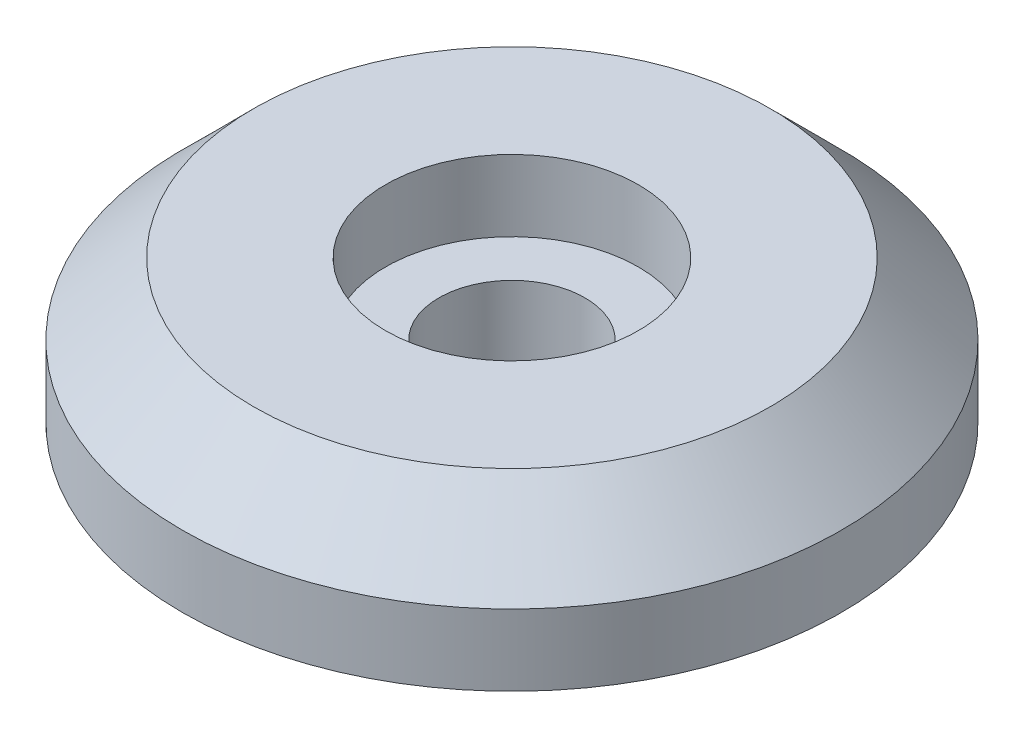
ISO-10303-21;
HEADER;
FILE_DESCRIPTION(('STEP AP214'),'2;1');
FILE_NAME('part.step','',(''),(''),'','','');
FILE_SCHEMA(('AUTOMOTIVE_DESIGN { 1 0 10303 214 1 1 1 1 }'));
ENDSEC;
DATA;
#1=APPLICATION_CONTEXT('core data for automotive mechanical design processes');
#2=APPLICATION_PROTOCOL_DEFINITION('international standard','automotive_design',2000,#1);
#3=PRODUCT_CONTEXT('',#1,'mechanical');
#4=PRODUCT('Part','Part','',(#3));
#5=PRODUCT_RELATED_PRODUCT_CATEGORY('part','',(#4));
#6=PRODUCT_DEFINITION_FORMATION('','',#4);
#7=PRODUCT_DEFINITION_CONTEXT('part definition',#1,'design');
#8=PRODUCT_DEFINITION('design','',#6,#7);
#9=PRODUCT_DEFINITION_SHAPE('','',#8);
#10=(LENGTH_UNIT() NAMED_UNIT(*) SI_UNIT(.MILLI.,.METRE.));
#11=(NAMED_UNIT(*) PLANE_ANGLE_UNIT() SI_UNIT($,.RADIAN.));
#12=(NAMED_UNIT(*) SI_UNIT($,.STERADIAN.) SOLID_ANGLE_UNIT());
#13=UNCERTAINTY_MEASURE_WITH_UNIT(LENGTH_MEASURE(1.E-05),#10,'distance_accuracy_value','');
#14=(GEOMETRIC_REPRESENTATION_CONTEXT(3) GLOBAL_UNCERTAINTY_ASSIGNED_CONTEXT((#13)) GLOBAL_UNIT_ASSIGNED_CONTEXT((#10,
#11,#12)) REPRESENTATION_CONTEXT('',''));
#15=CARTESIAN_POINT('',(0.,0.,0.));
#16=DIRECTION('',(0.,0.,1.));
#17=DIRECTION('',(1.,0.,0.));
#18=AXIS2_PLACEMENT_3D('',#15,#16,#17);
#19=CARTESIAN_POINT('',(0.,4.,0.));
#20=DIRECTION('',(0.,-1.,0.));
#21=DIRECTION('',(0.,0.,-1.));
#22=AXIS2_PLACEMENT_3D('',#19,#20,#21);
#23=CYLINDRICAL_SURFACE('',#22,2.05);
#24=CARTESIAN_POINT('',(0.,0.,0.));
#25=DIRECTION('',(0.,1.,0.));
#26=DIRECTION('',(0.,0.,1.));
#27=AXIS2_PLACEMENT_3D('',#24,#25,#26);
#28=CIRCLE('',#27,2.05);
#29=CARTESIAN_POINT('',(0.,0.,2.05));
#30=VERTEX_POINT('',#29);
#31=EDGE_CURVE('E63',#30,#30,#28,.T.);
#32=ORIENTED_EDGE('',*,*,#31,.F.);
#33=EDGE_LOOP('',(#32));
#34=FACE_BOUND('',#33,.T.);
#35=CARTESIAN_POINT('',(0.,2.,0.));
#36=DIRECTION('',(0.,1.,0.));
#37=DIRECTION('',(0.,0.,1.));
#38=AXIS2_PLACEMENT_3D('',#35,#36,#37);
#39=CIRCLE('',#38,2.05);
#40=CARTESIAN_POINT('',(0.,2.,2.05));
#41=VERTEX_POINT('',#40);
#42=EDGE_CURVE('E70',#41,#41,#39,.T.);
#43=ORIENTED_EDGE('',*,*,#42,.T.);
#44=EDGE_LOOP('',(#43));
#45=FACE_BOUND('',#44,.T.);
#46=ADVANCED_FACE('F44',(#34,#45),#23,.F.);
#47=CARTESIAN_POINT('',(0.,4.,0.));
#48=DIRECTION('',(0.,1.,0.));
#49=DIRECTION('',(0.,0.,1.));
#50=AXIS2_PLACEMENT_3D('',#47,#48,#49);
#51=PLANE('',#50);
#52=CARTESIAN_POINT('',(0.,4.,0.));
#53=DIRECTION('',(0.,1.,0.));
#54=DIRECTION('',(0.,0.,1.));
#55=AXIS2_PLACEMENT_3D('',#52,#53,#54);
#56=CIRCLE('',#55,7.25);
#57=CARTESIAN_POINT('',(0.,4.,7.25));
#58=VERTEX_POINT('',#57);
#59=EDGE_CURVE('E53',#58,#58,#56,.T.);
#60=ORIENTED_EDGE('',*,*,#59,.T.);
#61=EDGE_LOOP('',(#60));
#62=FACE_BOUND('',#61,.T.);
#63=CARTESIAN_POINT('',(0.,4.,0.));
#64=DIRECTION('',(0.,1.,0.));
#65=DIRECTION('',(0.,0.,1.));
#66=AXIS2_PLACEMENT_3D('',#63,#64,#65);
#67=CIRCLE('',#66,3.55);
#68=CARTESIAN_POINT('',(0.,4.,3.55));
#69=VERTEX_POINT('',#68);
#70=EDGE_CURVE('E73',#69,#69,#67,.T.);
#71=ORIENTED_EDGE('',*,*,#70,.F.);
#72=EDGE_LOOP('',(#71));
#73=FACE_BOUND('',#72,.T.);
#74=ADVANCED_FACE('F95',(#62,#73),#51,.T.);
#75=CARTESIAN_POINT('',(0.,0.,0.));
#76=DIRECTION('',(0.,1.,0.));
#77=DIRECTION('',(0.,0.,1.));
#78=AXIS2_PLACEMENT_3D('',#75,#76,#77);
#79=PLANE('',#78);
#80=CARTESIAN_POINT('',(0.,0.,0.));
#81=DIRECTION('',(0.,1.,0.));
#82=DIRECTION('',(0.,0.,1.));
#83=AXIS2_PLACEMENT_3D('',#80,#81,#82);
#84=CIRCLE('',#83,9.25);
#85=CARTESIAN_POINT('',(0.,0.,9.25));
#86=VERTEX_POINT('',#85);
#87=EDGE_CURVE('E56',#86,#86,#84,.T.);
#88=ORIENTED_EDGE('',*,*,#87,.F.);
#89=EDGE_LOOP('',(#88));
#90=FACE_BOUND('',#89,.T.);
#91=ORIENTED_EDGE('',*,*,#31,.T.);
#92=EDGE_LOOP('',(#91));
#93=FACE_BOUND('',#92,.T.);
#94=ADVANCED_FACE('F94',(#90,#93),#79,.F.);
#95=CARTESIAN_POINT('',(0.,4.,0.));
#96=DIRECTION('',(0.,-1.,0.));
#97=DIRECTION('',(0.,0.,-1.));
#98=AXIS2_PLACEMENT_3D('',#95,#96,#97);
#99=CYLINDRICAL_SURFACE('',#98,9.25);
#100=CARTESIAN_POINT('',(0.,1.99999999999999,0.));
#101=DIRECTION('',(0.,1.,0.));
#102=DIRECTION('',(0.,0.,1.));
#103=AXIS2_PLACEMENT_3D('',#100,#101,#102);
#104=CIRCLE('',#103,9.25);
#105=CARTESIAN_POINT('',(0.,1.99999999999999,9.25));
#106=VERTEX_POINT('',#105);
#107=EDGE_CURVE('E10',#106,#106,#104,.F.);
#108=ORIENTED_EDGE('',*,*,#107,.T.);
#109=EDGE_LOOP('',(#108));
#110=FACE_BOUND('',#109,.T.);
#111=ORIENTED_EDGE('',*,*,#87,.T.);
#112=EDGE_LOOP('',(#111));
#113=FACE_BOUND('',#112,.T.);
#114=ADVANCED_FACE('F86',(#110,#113),#99,.T.);
#115=CARTESIAN_POINT('',(0.,2.,0.));
#116=DIRECTION('',(0.,1.,0.));
#117=DIRECTION('',(0.,0.,1.));
#118=AXIS2_PLACEMENT_3D('',#115,#116,#117);
#119=CYLINDRICAL_SURFACE('',#118,3.55);
#120=CARTESIAN_POINT('',(0.,2.,0.));
#121=DIRECTION('',(0.,1.,0.));
#122=DIRECTION('',(0.,0.,1.));
#123=AXIS2_PLACEMENT_3D('',#120,#121,#122);
#124=CIRCLE('',#123,3.55);
#125=CARTESIAN_POINT('',(0.,2.,3.55));
#126=VERTEX_POINT('',#125);
#127=EDGE_CURVE('E69',#126,#126,#124,.T.);
#128=ORIENTED_EDGE('',*,*,#127,.F.);
#129=EDGE_LOOP('',(#128));
#130=FACE_BOUND('',#129,.T.);
#131=ORIENTED_EDGE('',*,*,#70,.T.);
#132=EDGE_LOOP('',(#131));
#133=FACE_BOUND('',#132,.T.);
#134=ADVANCED_FACE('F84',(#130,#133),#119,.F.);
#135=CARTESIAN_POINT('',(0.,2.,0.));
#136=DIRECTION('',(0.,1.,0.));
#137=DIRECTION('',(0.,0.,1.));
#138=AXIS2_PLACEMENT_3D('',#135,#136,#137);
#139=PLANE('',#138);
#140=ORIENTED_EDGE('',*,*,#42,.F.);
#141=EDGE_LOOP('',(#140));
#142=FACE_BOUND('',#141,.T.);
#143=ORIENTED_EDGE('',*,*,#127,.T.);
#144=EDGE_LOOP('',(#143));
#145=FACE_BOUND('',#144,.T.);
#146=ADVANCED_FACE('F83',(#142,#145),#139,.T.);
#147=CARTESIAN_POINT('',(0.,4.,0.));
#148=DIRECTION('',(0.,-1.,0.));
#149=DIRECTION('',(0.,0.,-1.));
#150=AXIS2_PLACEMENT_3D('',#147,#148,#149);
#151=CONICAL_SURFACE('',#150,7.25,0.785398163397446);
#152=ORIENTED_EDGE('',*,*,#107,.F.);
#153=EDGE_LOOP('',(#152));
#154=FACE_BOUND('',#153,.T.);
#155=ORIENTED_EDGE('',*,*,#59,.F.);
#156=EDGE_LOOP('',(#155));
#157=FACE_BOUND('',#156,.T.);
#158=ADVANCED_FACE('F48',(#154,#157),#151,.T.);
#159=CLOSED_SHELL('',(#46,#74,#94,#114,#134,#146,#158));
#160=MANIFOLD_SOLID_BREP('B2',#159);
#161=ADVANCED_BREP_SHAPE_REPRESENTATION('',(#18,#160),#14);
#162=SHAPE_DEFINITION_REPRESENTATION(#9,#161);
ENDSEC;
END-ISO-10303-21;
